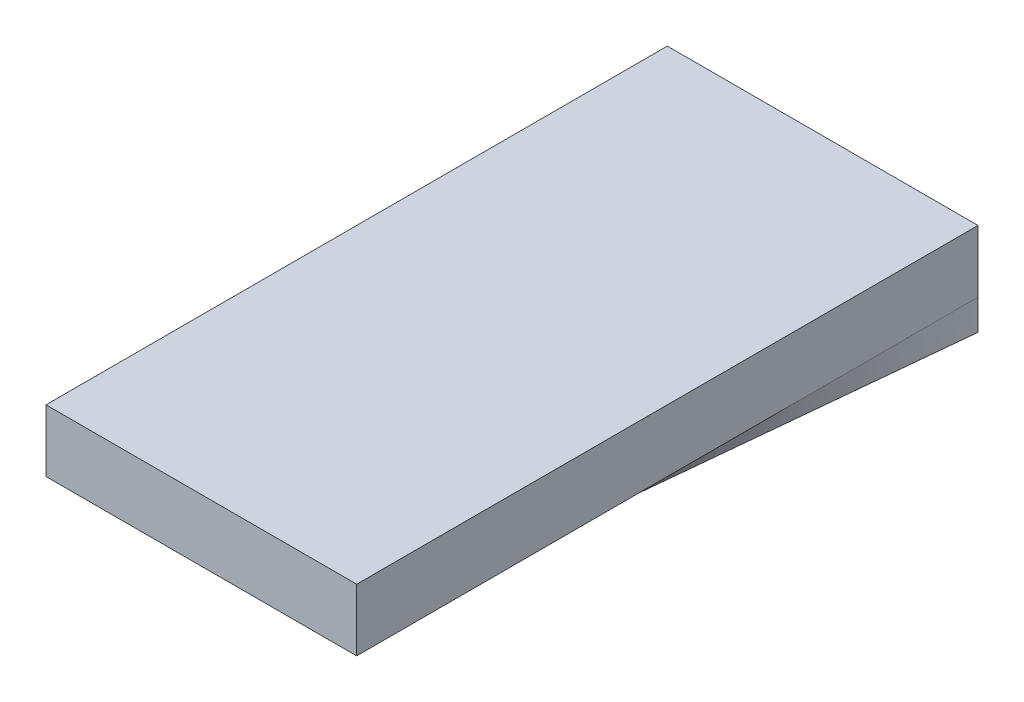
ISO-10303-21;
HEADER;
FILE_DESCRIPTION(('STEP AP214'),'2;1');
FILE_NAME('part.step','',(''),(''),'','','');
FILE_SCHEMA(('AUTOMOTIVE_DESIGN { 1 0 10303 214 1 1 1 1 }'));
ENDSEC;
DATA;
#1=APPLICATION_CONTEXT('core data for automotive mechanical design processes');
#2=APPLICATION_PROTOCOL_DEFINITION('international standard','automotive_design',2000,#1);
#3=PRODUCT_CONTEXT('',#1,'mechanical');
#4=PRODUCT('Part','Part','',(#3));
#5=PRODUCT_RELATED_PRODUCT_CATEGORY('part','',(#4));
#6=PRODUCT_DEFINITION_FORMATION('','',#4);
#7=PRODUCT_DEFINITION_CONTEXT('part definition',#1,'design');
#8=PRODUCT_DEFINITION('design','',#6,#7);
#9=PRODUCT_DEFINITION_SHAPE('','',#8);
#10=(LENGTH_UNIT() NAMED_UNIT(*) SI_UNIT(.MILLI.,.METRE.));
#11=(NAMED_UNIT(*) PLANE_ANGLE_UNIT() SI_UNIT($,.RADIAN.));
#12=(NAMED_UNIT(*) SI_UNIT($,.STERADIAN.) SOLID_ANGLE_UNIT());
#13=UNCERTAINTY_MEASURE_WITH_UNIT(LENGTH_MEASURE(1.E-05),#10,'distance_accuracy_value','');
#14=(GEOMETRIC_REPRESENTATION_CONTEXT(3) GLOBAL_UNCERTAINTY_ASSIGNED_CONTEXT((#13)) GLOBAL_UNIT_ASSIGNED_CONTEXT((#10,
#11,#12)) REPRESENTATION_CONTEXT('',''));
#15=CARTESIAN_POINT('',(0.,0.,0.));
#16=DIRECTION('',(0.,0.,1.));
#17=DIRECTION('',(1.,0.,0.));
#18=AXIS2_PLACEMENT_3D('',#15,#16,#17);
#19=CARTESIAN_POINT('',(0.,0.,0.));
#20=DIRECTION('',(0.,0.,-1.));
#21=DIRECTION('',(-1.,0.,0.));
#22=AXIS2_PLACEMENT_3D('',#19,#20,#21);
#23=PLANE('',#22);
#24=DIRECTION('',(0.,-1.,0.));
#25=VECTOR('',#24,1.);
#26=CARTESIAN_POINT('',(25.,0.,0.));
#27=LINE('',#26,#25);
#28=CARTESIAN_POINT('',(25.,0.,0.));
#29=VERTEX_POINT('',#28);
#30=CARTESIAN_POINT('',(25.,-4.89766081871346,0.));
#31=VERTEX_POINT('',#30);
#32=EDGE_CURVE('E151',#29,#31,#27,.T.);
#33=ORIENTED_EDGE('',*,*,#32,.T.);
#34=CARTESIAN_POINT('',(25.,-4.89766081871346,0.));
#35=CARTESIAN_POINT('',(0.,4.89766081871346,0.));
#36=CARTESIAN_POINT('',(-25.,-4.89766081871346,0.));
#37=B_SPLINE_CURVE_WITH_KNOTS('',2,(#34,#35,#36),.UNSPECIFIED.,.F.,.F.,(3,3),(0.,1.),.UNSPECIFIED.);
#38=CARTESIAN_POINT('',(-25.,-4.89766081871346,0.));
#39=VERTEX_POINT('',#38);
#40=EDGE_CURVE('E153',#31,#39,#37,.T.);
#41=ORIENTED_EDGE('',*,*,#40,.T.);
#42=DIRECTION('',(0.,1.,0.));
#43=VECTOR('',#42,1.);
#44=CARTESIAN_POINT('',(-25.,-4.89766081871346,0.));
#45=LINE('',#44,#43);
#46=CARTESIAN_POINT('',(-25.,0.,0.));
#47=VERTEX_POINT('',#46);
#48=EDGE_CURVE('E317',#39,#47,#45,.T.);
#49=ORIENTED_EDGE('',*,*,#48,.T.);
#50=DIRECTION('',(0.,-1.,0.));
#51=VECTOR('',#50,1.);
#52=CARTESIAN_POINT('',(-25.,10.,0.));
#53=LINE('',#52,#51);
#54=CARTESIAN_POINT('',(-25.,10.,0.));
#55=VERTEX_POINT('',#54);
#56=EDGE_CURVE('E311',#55,#47,#53,.T.);
#57=ORIENTED_EDGE('',*,*,#56,.F.);
#58=DIRECTION('',(1.,0.,0.));
#59=VECTOR('',#58,1.);
#60=CARTESIAN_POINT('',(-25.,10.,0.));
#61=LINE('',#60,#59);
#62=CARTESIAN_POINT('',(25.,10.,0.));
#63=VERTEX_POINT('',#62);
#64=EDGE_CURVE('E79',#55,#63,#61,.T.);
#65=ORIENTED_EDGE('',*,*,#64,.T.);
#66=DIRECTION('',(0.,-1.,0.));
#67=VECTOR('',#66,1.);
#68=CARTESIAN_POINT('',(25.,10.,0.));
#69=LINE('',#68,#67);
#70=EDGE_CURVE('E12',#63,#29,#69,.T.);
#71=ORIENTED_EDGE('',*,*,#70,.T.);
#72=EDGE_LOOP('',(#33,#41,#49,#57,#65,#71));
#73=FACE_BOUND('',#72,.T.);
#74=ADVANCED_FACE('F69',(#73),#23,.T.);
#75=CARTESIAN_POINT('',(0.,0.,100.));
#76=DIRECTION('',(0.,0.,1.));
#77=DIRECTION('',(1.,0.,0.));
#78=AXIS2_PLACEMENT_3D('',#75,#76,#77);
#79=PLANE('',#78);
#80=DIRECTION('',(0.,-1.,0.));
#81=VECTOR('',#80,1.);
#82=CARTESIAN_POINT('',(-25.,10.,100.));
#83=LINE('',#82,#81);
#84=CARTESIAN_POINT('',(-25.,10.,100.));
#85=VERTEX_POINT('',#84);
#86=CARTESIAN_POINT('',(-25.,0.,100.));
#87=VERTEX_POINT('',#86);
#88=EDGE_CURVE('E126',#85,#87,#83,.T.);
#89=ORIENTED_EDGE('',*,*,#88,.T.);
#90=DIRECTION('',(1.,0.,0.));
#91=VECTOR('',#90,1.);
#92=CARTESIAN_POINT('',(-25.,0.,100.));
#93=LINE('',#92,#91);
#94=CARTESIAN_POINT('',(20.5392809587217,0.,100.));
#95=VERTEX_POINT('',#94);
#96=EDGE_CURVE('E267',#87,#95,#93,.T.);
#97=ORIENTED_EDGE('',*,*,#96,.T.);
#98=CARTESIAN_POINT('',(25.,0.,100.));
#99=VERTEX_POINT('',#98);
#100=EDGE_CURVE('E145',#95,#99,#93,.T.);
#101=ORIENTED_EDGE('',*,*,#100,.T.);
#102=DIRECTION('',(0.,1.,0.));
#103=VECTOR('',#102,1.);
#104=CARTESIAN_POINT('',(25.,10.,100.));
#105=LINE('',#104,#103);
#106=CARTESIAN_POINT('',(25.,10.,100.));
#107=VERTEX_POINT('',#106);
#108=EDGE_CURVE('E129',#99,#107,#105,.T.);
#109=ORIENTED_EDGE('',*,*,#108,.T.);
#110=DIRECTION('',(-1.,0.,0.));
#111=VECTOR('',#110,1.);
#112=CARTESIAN_POINT('',(-25.,10.,100.));
#113=LINE('',#112,#111);
#114=EDGE_CURVE('E122',#107,#85,#113,.T.);
#115=ORIENTED_EDGE('',*,*,#114,.T.);
#116=EDGE_LOOP('',(#89,#97,#101,#109,#115));
#117=FACE_BOUND('',#116,.T.);
#118=ADVANCED_FACE('F125',(#117),#79,.T.);
#119=CARTESIAN_POINT('',(25.,10.,100.));
#120=DIRECTION('',(1.,0.,0.));
#121=DIRECTION('',(0.,-1.,0.));
#122=AXIS2_PLACEMENT_3D('',#119,#120,#121);
#123=PLANE('',#122);
#124=ORIENTED_EDGE('',*,*,#108,.F.);
#125=DIRECTION('',(0.,0.,-1.));
#126=VECTOR('',#125,1.);
#127=CARTESIAN_POINT('',(25.,0.,50.));
#128=LINE('',#127,#126);
#129=EDGE_CURVE('E165',#99,#29,#128,.T.);
#130=ORIENTED_EDGE('',*,*,#129,.T.);
#131=ORIENTED_EDGE('',*,*,#70,.F.);
#132=DIRECTION('',(0.,0.,1.));
#133=VECTOR('',#132,1.);
#134=CARTESIAN_POINT('',(25.,10.,50.));
#135=LINE('',#134,#133);
#136=EDGE_CURVE('E94',#63,#107,#135,.T.);
#137=ORIENTED_EDGE('',*,*,#136,.T.);
#138=EDGE_LOOP('',(#124,#130,#131,#137));
#139=FACE_BOUND('',#138,.T.);
#140=ADVANCED_FACE('F177',(#139),#123,.T.);
#141=CARTESIAN_POINT('',(25.,0.,100.));
#142=CARTESIAN_POINT('',(25.,0.,0.));
#143=CARTESIAN_POINT('',(20.5392809587217,0.,100.));
#144=CARTESIAN_POINT('',(25.,-4.89766081871346,0.));
#145=B_SPLINE_SURFACE_WITH_KNOTS('',1,1,((#141,#142),(#143,#144)),.UNSPECIFIED.,.F.,.F.,.F.,(2,
2),(2,2),(0.,1.),(0.,1.),.UNSPECIFIED.);
#146=DIRECTION('',(0.0445096318567373,-0.0488694934567393,-0.997812941027154));
#147=VECTOR('',#146,1.);
#148=CARTESIAN_POINT('',(22.7696404793608,-2.44883040935673,50.));
#149=LINE('',#148,#147);
#150=EDGE_CURVE('E155',#95,#31,#149,.T.);
#151=ORIENTED_EDGE('',*,*,#100,.F.);
#152=ORIENTED_EDGE('',*,*,#150,.T.);
#153=ORIENTED_EDGE('',*,*,#32,.F.);
#154=ORIENTED_EDGE('',*,*,#129,.F.);
#155=EDGE_LOOP('',(#151,#152,#153,#154));
#156=FACE_BOUND('',#155,.T.);
#157=ADVANCED_FACE('F187',(#156),#145,.T.);
#158=CARTESIAN_POINT('',(-25.,10.,100.));
#159=DIRECTION('',(0.,1.,0.));
#160=DIRECTION('',(1.,0.,0.));
#161=AXIS2_PLACEMENT_3D('',#158,#159,#160);
#162=PLANE('',#161);
#163=ORIENTED_EDGE('',*,*,#114,.F.);
#164=ORIENTED_EDGE('',*,*,#136,.F.);
#165=ORIENTED_EDGE('',*,*,#64,.F.);
#166=DIRECTION('',(0.,0.,-1.));
#167=VECTOR('',#166,1.);
#168=CARTESIAN_POINT('',(-25.,10.,50.));
#169=LINE('',#168,#167);
#170=EDGE_CURVE('E140',#85,#55,#169,.T.);
#171=ORIENTED_EDGE('',*,*,#170,.F.);
#172=EDGE_LOOP('',(#163,#164,#165,#171));
#173=FACE_BOUND('',#172,.T.);
#174=ADVANCED_FACE('F149',(#173),#162,.T.);
#175=CARTESIAN_POINT('',(20.5392809587217,0.,100.));
#176=CARTESIAN_POINT('',(25.,-4.89766081871346,0.));
#177=CARTESIAN_POINT('',(16.7443408788282,0.,100.));
#178=CARTESIAN_POINT('',(20.8333333333333,-3.26510721247564,0.));
#179=CARTESIAN_POINT('',(9.15446071904128,0.,100.));
#180=CARTESIAN_POINT('',(12.5,-0.816276803118903,0.));
#181=CARTESIAN_POINT('',(-2.23035952063915,0.,99.9999999999999));
#182=CARTESIAN_POINT('',(0.,0.408138401559449,0.));
#183=CARTESIAN_POINT('',(-13.6151797603196,0.,100.));
#184=CARTESIAN_POINT('',(-12.5,-0.816276803118904,0.));
#185=CARTESIAN_POINT('',(-21.2050599201065,0.,100.));
#186=CARTESIAN_POINT('',(-20.8333333333333,-3.26510721247564,0.));
#187=CARTESIAN_POINT('',(-25.,0.,100.));
#188=CARTESIAN_POINT('',(-25.,-4.89766081871346,0.));
#189=B_SPLINE_SURFACE_WITH_KNOTS('',3,1,((#175,#176),(#177,#178),(#179,#180),(#181,#182),(#183,
#184),(#185,#186),(#187,#188)),.UNSPECIFIED.,.F.,.F.,.F.,(4,1,1,1,4),(2,2),(0.,0.25,0.5,0.75,
1.),(0.,1.),.UNSPECIFIED.);
#190=DIRECTION('',(0.,-0.0489179733573599,-0.998802799296542));
#191=VECTOR('',#190,1.);
#192=CARTESIAN_POINT('',(-25.,-2.44883040935673,50.));
#193=LINE('',#192,#191);
#194=EDGE_CURVE('E143',#87,#39,#193,.T.);
#195=ORIENTED_EDGE('',*,*,#96,.F.);
#196=ORIENTED_EDGE('',*,*,#194,.T.);
#197=ORIENTED_EDGE('',*,*,#40,.F.);
#198=ORIENTED_EDGE('',*,*,#150,.F.);
#199=EDGE_LOOP('',(#195,#196,#197,#198));
#200=FACE_BOUND('',#199,.T.);
#201=ADVANCED_FACE('F224',(#200),#189,.T.);
#202=CARTESIAN_POINT('',(-25.,0.,100.));
#203=DIRECTION('',(-1.,0.,0.));
#204=DIRECTION('',(0.,1.,0.));
#205=AXIS2_PLACEMENT_3D('',#202,#203,#204);
#206=PLANE('',#205);
#207=ORIENTED_EDGE('',*,*,#88,.F.);
#208=ORIENTED_EDGE('',*,*,#170,.T.);
#209=ORIENTED_EDGE('',*,*,#56,.T.);
#210=ORIENTED_EDGE('',*,*,#48,.F.);
#211=ORIENTED_EDGE('',*,*,#194,.F.);
#212=EDGE_LOOP('',(#207,#208,#209,#210,#211));
#213=FACE_BOUND('',#212,.T.);
#214=ADVANCED_FACE('F139',(#213),#206,.T.);
#215=CLOSED_SHELL('',(#74,#118,#140,#157,#174,#201,#214));
#216=MANIFOLD_SOLID_BREP('B2',#215);
#217=ADVANCED_BREP_SHAPE_REPRESENTATION('',(#18,#216),#14);
#218=SHAPE_DEFINITION_REPRESENTATION(#9,#217);
ENDSEC;
END-ISO-10303-21;
